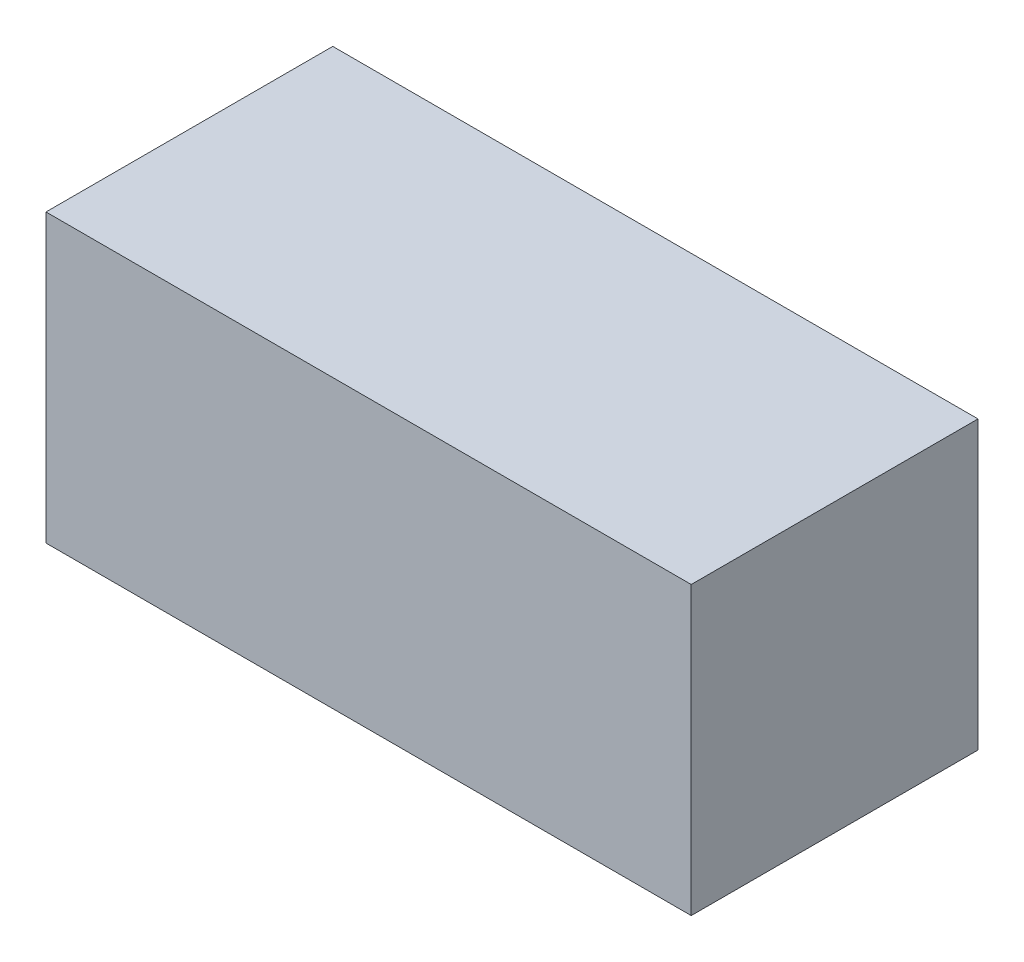
ISO-10303-21;
HEADER;
FILE_DESCRIPTION(('STEP AP214'),'2;1');
FILE_NAME('part.step','',(''),(''),'','','');
FILE_SCHEMA(('AUTOMOTIVE_DESIGN { 1 0 10303 214 1 1 1 1 }'));
ENDSEC;
DATA;
#1=APPLICATION_CONTEXT('core data for automotive mechanical design processes');
#2=APPLICATION_PROTOCOL_DEFINITION('international standard','automotive_design',2000,#1);
#3=PRODUCT_CONTEXT('',#1,'mechanical');
#4=PRODUCT('Part','Part','',(#3));
#5=PRODUCT_RELATED_PRODUCT_CATEGORY('part','',(#4));
#6=PRODUCT_DEFINITION_FORMATION('','',#4);
#7=PRODUCT_DEFINITION_CONTEXT('part definition',#1,'design');
#8=PRODUCT_DEFINITION('design','',#6,#7);
#9=PRODUCT_DEFINITION_SHAPE('','',#8);
#10=(LENGTH_UNIT() NAMED_UNIT(*) SI_UNIT(.MILLI.,.METRE.));
#11=(NAMED_UNIT(*) PLANE_ANGLE_UNIT() SI_UNIT($,.RADIAN.));
#12=(NAMED_UNIT(*) SI_UNIT($,.STERADIAN.) SOLID_ANGLE_UNIT());
#13=UNCERTAINTY_MEASURE_WITH_UNIT(LENGTH_MEASURE(1.E-05),#10,'distance_accuracy_value','');
#14=(GEOMETRIC_REPRESENTATION_CONTEXT(3) GLOBAL_UNCERTAINTY_ASSIGNED_CONTEXT((#13)) GLOBAL_UNIT_ASSIGNED_CONTEXT((#10,
#11,#12)) REPRESENTATION_CONTEXT('',''));
#15=CARTESIAN_POINT('',(0.,0.,0.));
#16=DIRECTION('',(0.,0.,1.));
#17=DIRECTION('',(1.,0.,0.));
#18=AXIS2_PLACEMENT_3D('',#15,#16,#17);
#19=CARTESIAN_POINT('',(0.,203.2,0.));
#20=DIRECTION('',(-1.,0.,0.));
#21=DIRECTION('',(0.,0.,1.));
#22=AXIS2_PLACEMENT_3D('',#19,#20,#21);
#23=PLANE('',#22);
#24=DIRECTION('',(0.,0.,-1.));
#25=VECTOR('',#24,1.);
#26=CARTESIAN_POINT('',(0.,0.,0.));
#27=LINE('',#26,#25);
#28=CARTESIAN_POINT('',(0.,0.,0.));
#29=VERTEX_POINT('',#28);
#30=CARTESIAN_POINT('',(0.,0.,-203.2));
#31=VERTEX_POINT('',#30);
#32=EDGE_CURVE('E96',#29,#31,#27,.T.);
#33=ORIENTED_EDGE('',*,*,#32,.T.);
#34=DIRECTION('',(0.,-1.,0.));
#35=VECTOR('',#34,1.);
#36=CARTESIAN_POINT('',(0.,203.2,-203.2));
#37=LINE('',#36,#35);
#38=CARTESIAN_POINT('',(0.,203.2,-203.2));
#39=VERTEX_POINT('',#38);
#40=EDGE_CURVE('E11',#39,#31,#37,.T.);
#41=ORIENTED_EDGE('',*,*,#40,.F.);
#42=DIRECTION('',(0.,0.,-1.));
#43=VECTOR('',#42,1.);
#44=CARTESIAN_POINT('',(0.,203.2,0.));
#45=LINE('',#44,#43);
#46=CARTESIAN_POINT('',(0.,203.2,0.));
#47=VERTEX_POINT('',#46);
#48=EDGE_CURVE('E84',#47,#39,#45,.T.);
#49=ORIENTED_EDGE('',*,*,#48,.F.);
#50=DIRECTION('',(0.,-1.,0.));
#51=VECTOR('',#50,1.);
#52=CARTESIAN_POINT('',(0.,203.2,0.));
#53=LINE('',#52,#51);
#54=EDGE_CURVE('E92',#47,#29,#53,.T.);
#55=ORIENTED_EDGE('',*,*,#54,.T.);
#56=EDGE_LOOP('',(#33,#41,#49,#55));
#57=FACE_BOUND('',#56,.T.);
#58=ADVANCED_FACE('F33',(#57),#23,.F.);
#59=CARTESIAN_POINT('',(0.,203.2,-203.2));
#60=DIRECTION('',(0.,0.,1.));
#61=DIRECTION('',(1.,0.,0.));
#62=AXIS2_PLACEMENT_3D('',#59,#60,#61);
#63=PLANE('',#62);
#64=DIRECTION('',(-1.,0.,0.));
#65=VECTOR('',#64,1.);
#66=CARTESIAN_POINT('',(0.,0.,-203.2));
#67=LINE('',#66,#65);
#68=CARTESIAN_POINT('',(-457.2,0.,-203.2));
#69=VERTEX_POINT('',#68);
#70=EDGE_CURVE('E88',#31,#69,#67,.T.);
#71=ORIENTED_EDGE('',*,*,#70,.T.);
#72=DIRECTION('',(0.,-1.,0.));
#73=VECTOR('',#72,1.);
#74=CARTESIAN_POINT('',(-457.2,203.2,-203.2));
#75=LINE('',#74,#73);
#76=CARTESIAN_POINT('',(-457.2,203.2,-203.2));
#77=VERTEX_POINT('',#76);
#78=EDGE_CURVE('E41',#77,#69,#75,.T.);
#79=ORIENTED_EDGE('',*,*,#78,.F.);
#80=DIRECTION('',(-1.,0.,0.));
#81=VECTOR('',#80,1.);
#82=CARTESIAN_POINT('',(0.,203.2,-203.2));
#83=LINE('',#82,#81);
#84=EDGE_CURVE('E79',#39,#77,#83,.T.);
#85=ORIENTED_EDGE('',*,*,#84,.F.);
#86=ORIENTED_EDGE('',*,*,#40,.T.);
#87=EDGE_LOOP('',(#71,#79,#85,#86));
#88=FACE_BOUND('',#87,.T.);
#89=ADVANCED_FACE('F87',(#88),#63,.F.);
#90=CARTESIAN_POINT('',(-457.2,203.2,0.));
#91=DIRECTION('',(1.,0.,0.));
#92=DIRECTION('',(0.,0.,-1.));
#93=AXIS2_PLACEMENT_3D('',#90,#91,#92);
#94=PLANE('',#93);
#95=DIRECTION('',(0.,0.,1.));
#96=VECTOR('',#95,1.);
#97=CARTESIAN_POINT('',(-457.2,0.,0.));
#98=LINE('',#97,#96);
#99=CARTESIAN_POINT('',(-457.2,0.,0.));
#100=VERTEX_POINT('',#99);
#101=EDGE_CURVE('E66',#69,#100,#98,.T.);
#102=ORIENTED_EDGE('',*,*,#101,.T.);
#103=DIRECTION('',(0.,-1.,0.));
#104=VECTOR('',#103,1.);
#105=CARTESIAN_POINT('',(-457.2,203.2,0.));
#106=LINE('',#105,#104);
#107=CARTESIAN_POINT('',(-457.2,203.2,0.));
#108=VERTEX_POINT('',#107);
#109=EDGE_CURVE('E89',#108,#100,#106,.T.);
#110=ORIENTED_EDGE('',*,*,#109,.F.);
#111=DIRECTION('',(0.,0.,1.));
#112=VECTOR('',#111,1.);
#113=CARTESIAN_POINT('',(-457.2,203.2,0.));
#114=LINE('',#113,#112);
#115=EDGE_CURVE('E82',#77,#108,#114,.T.);
#116=ORIENTED_EDGE('',*,*,#115,.F.);
#117=ORIENTED_EDGE('',*,*,#78,.T.);
#118=EDGE_LOOP('',(#102,#110,#116,#117));
#119=FACE_BOUND('',#118,.T.);
#120=ADVANCED_FACE('F90',(#119),#94,.F.);
#121=CARTESIAN_POINT('',(0.,203.2,0.));
#122=DIRECTION('',(0.,0.,-1.));
#123=DIRECTION('',(-1.,0.,0.));
#124=AXIS2_PLACEMENT_3D('',#121,#122,#123);
#125=PLANE('',#124);
#126=DIRECTION('',(1.,0.,0.));
#127=VECTOR('',#126,1.);
#128=CARTESIAN_POINT('',(0.,0.,0.));
#129=LINE('',#128,#127);
#130=EDGE_CURVE('E72',#100,#29,#129,.T.);
#131=ORIENTED_EDGE('',*,*,#130,.T.);
#132=ORIENTED_EDGE('',*,*,#54,.F.);
#133=DIRECTION('',(1.,0.,0.));
#134=VECTOR('',#133,1.);
#135=CARTESIAN_POINT('',(0.,203.2,0.));
#136=LINE('',#135,#134);
#137=EDGE_CURVE('E49',#108,#47,#136,.T.);
#138=ORIENTED_EDGE('',*,*,#137,.F.);
#139=ORIENTED_EDGE('',*,*,#109,.T.);
#140=EDGE_LOOP('',(#131,#132,#138,#139));
#141=FACE_BOUND('',#140,.T.);
#142=ADVANCED_FACE('F103',(#141),#125,.F.);
#143=CARTESIAN_POINT('',(0.,203.2,0.));
#144=DIRECTION('',(0.,1.,0.));
#145=DIRECTION('',(0.,0.,1.));
#146=AXIS2_PLACEMENT_3D('',#143,#144,#145);
#147=PLANE('',#146);
#148=ORIENTED_EDGE('',*,*,#48,.T.);
#149=ORIENTED_EDGE('',*,*,#84,.T.);
#150=ORIENTED_EDGE('',*,*,#115,.T.);
#151=ORIENTED_EDGE('',*,*,#137,.T.);
#152=EDGE_LOOP('',(#148,#149,#150,#151));
#153=FACE_BOUND('',#152,.T.);
#154=ADVANCED_FACE('F80',(#153),#147,.T.);
#155=CARTESIAN_POINT('',(0.,0.,0.));
#156=DIRECTION('',(0.,1.,0.));
#157=DIRECTION('',(0.,0.,1.));
#158=AXIS2_PLACEMENT_3D('',#155,#156,#157);
#159=PLANE('',#158);
#160=ORIENTED_EDGE('',*,*,#32,.F.);
#161=ORIENTED_EDGE('',*,*,#130,.F.);
#162=ORIENTED_EDGE('',*,*,#101,.F.);
#163=ORIENTED_EDGE('',*,*,#70,.F.);
#164=EDGE_LOOP('',(#160,#161,#162,#163));
#165=FACE_BOUND('',#164,.T.);
#166=ADVANCED_FACE('F106',(#165),#159,.F.);
#167=CLOSED_SHELL('',(#58,#89,#120,#142,#154,#166));
#168=MANIFOLD_SOLID_BREP('B2',#167);
#169=ADVANCED_BREP_SHAPE_REPRESENTATION('',(#18,#168),#14);
#170=SHAPE_DEFINITION_REPRESENTATION(#9,#169);
ENDSEC;
END-ISO-10303-21;
